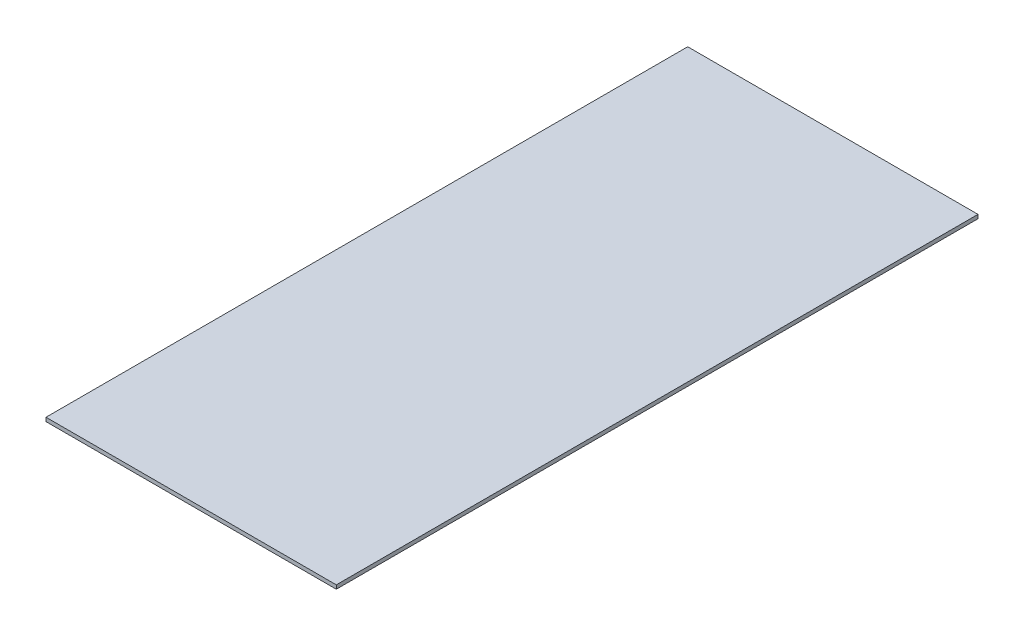
ISO-10303-21;
HEADER;
FILE_DESCRIPTION(('STEP AP214'),'2;1');
FILE_NAME('part.step','',(''),(''),'','','');
FILE_SCHEMA(('AUTOMOTIVE_DESIGN { 1 0 10303 214 1 1 1 1 }'));
ENDSEC;
DATA;
#1=APPLICATION_CONTEXT('core data for automotive mechanical design processes');
#2=APPLICATION_PROTOCOL_DEFINITION('international standard','automotive_design',2000,#1);
#3=PRODUCT_CONTEXT('',#1,'mechanical');
#4=PRODUCT('Part','Part','',(#3));
#5=PRODUCT_RELATED_PRODUCT_CATEGORY('part','',(#4));
#6=PRODUCT_DEFINITION_FORMATION('','',#4);
#7=PRODUCT_DEFINITION_CONTEXT('part definition',#1,'design');
#8=PRODUCT_DEFINITION('design','',#6,#7);
#9=PRODUCT_DEFINITION_SHAPE('','',#8);
#10=(LENGTH_UNIT() NAMED_UNIT(*) SI_UNIT(.MILLI.,.METRE.));
#11=(NAMED_UNIT(*) PLANE_ANGLE_UNIT() SI_UNIT($,.RADIAN.));
#12=(NAMED_UNIT(*) SI_UNIT($,.STERADIAN.) SOLID_ANGLE_UNIT());
#13=UNCERTAINTY_MEASURE_WITH_UNIT(LENGTH_MEASURE(1.E-05),#10,'distance_accuracy_value','');
#14=(GEOMETRIC_REPRESENTATION_CONTEXT(3) GLOBAL_UNCERTAINTY_ASSIGNED_CONTEXT((#13)) GLOBAL_UNIT_ASSIGNED_CONTEXT((#10,
#11,#12)) REPRESENTATION_CONTEXT('',''));
#15=CARTESIAN_POINT('',(0.,0.,0.));
#16=DIRECTION('',(0.,0.,1.));
#17=DIRECTION('',(1.,0.,0.));
#18=AXIS2_PLACEMENT_3D('',#15,#16,#17);
#19=CARTESIAN_POINT('',(-241.3,-3.17500000000003,1066.8));
#20=DIRECTION('',(1.,0.,0.));
#21=DIRECTION('',(0.,0.,-1.));
#22=AXIS2_PLACEMENT_3D('',#19,#20,#21);
#23=PLANE('',#22);
#24=DIRECTION('',(0.,-1.,0.));
#25=VECTOR('',#24,1.);
#26=CARTESIAN_POINT('',(-241.3,-3.17500000000003,0.));
#27=LINE('',#26,#25);
#28=CARTESIAN_POINT('',(-241.3,3.17499999999997,0.));
#29=VERTEX_POINT('',#28);
#30=CARTESIAN_POINT('',(-241.3,-3.17500000000003,0.));
#31=VERTEX_POINT('',#30);
#32=EDGE_CURVE('E107',#29,#31,#27,.T.);
#33=ORIENTED_EDGE('',*,*,#32,.T.);
#34=DIRECTION('',(0.,0.,-1.));
#35=VECTOR('',#34,1.);
#36=CARTESIAN_POINT('',(-241.3,-3.17500000000003,1066.8));
#37=LINE('',#36,#35);
#38=CARTESIAN_POINT('',(-241.3,-3.17500000000003,1066.8));
#39=VERTEX_POINT('',#38);
#40=EDGE_CURVE('E11',#39,#31,#37,.T.);
#41=ORIENTED_EDGE('',*,*,#40,.F.);
#42=DIRECTION('',(0.,-1.,0.));
#43=VECTOR('',#42,1.);
#44=CARTESIAN_POINT('',(-241.3,-3.17500000000003,1066.8));
#45=LINE('',#44,#43);
#46=CARTESIAN_POINT('',(-241.3,3.17499999999997,1066.8));
#47=VERTEX_POINT('',#46);
#48=EDGE_CURVE('E91',#47,#39,#45,.T.);
#49=ORIENTED_EDGE('',*,*,#48,.F.);
#50=DIRECTION('',(0.,0.,-1.));
#51=VECTOR('',#50,1.);
#52=CARTESIAN_POINT('',(-241.3,3.17499999999997,1066.8));
#53=LINE('',#52,#51);
#54=EDGE_CURVE('E103',#47,#29,#53,.T.);
#55=ORIENTED_EDGE('',*,*,#54,.T.);
#56=EDGE_LOOP('',(#33,#41,#49,#55));
#57=FACE_BOUND('',#56,.T.);
#58=ADVANCED_FACE('F39',(#57),#23,.F.);
#59=CARTESIAN_POINT('',(241.3,-3.17499999999997,1066.8));
#60=DIRECTION('',(0.,1.,0.));
#61=DIRECTION('',(-1.,0.,0.));
#62=AXIS2_PLACEMENT_3D('',#59,#60,#61);
#63=PLANE('',#62);
#64=DIRECTION('',(1.,0.,0.));
#65=VECTOR('',#64,1.);
#66=CARTESIAN_POINT('',(241.3,-3.17499999999997,0.));
#67=LINE('',#66,#65);
#68=CARTESIAN_POINT('',(241.3,-3.17499999999997,0.));
#69=VERTEX_POINT('',#68);
#70=EDGE_CURVE('E96',#31,#69,#67,.T.);
#71=ORIENTED_EDGE('',*,*,#70,.T.);
#72=DIRECTION('',(0.,0.,-1.));
#73=VECTOR('',#72,1.);
#74=CARTESIAN_POINT('',(241.3,-3.17499999999997,1066.8));
#75=LINE('',#74,#73);
#76=CARTESIAN_POINT('',(241.3,-3.17499999999997,1066.8));
#77=VERTEX_POINT('',#76);
#78=EDGE_CURVE('E48',#77,#69,#75,.T.);
#79=ORIENTED_EDGE('',*,*,#78,.F.);
#80=DIRECTION('',(1.,0.,0.));
#81=VECTOR('',#80,1.);
#82=CARTESIAN_POINT('',(241.3,-3.17499999999997,1066.8));
#83=LINE('',#82,#81);
#84=EDGE_CURVE('E86',#39,#77,#83,.T.);
#85=ORIENTED_EDGE('',*,*,#84,.F.);
#86=ORIENTED_EDGE('',*,*,#40,.T.);
#87=EDGE_LOOP('',(#71,#79,#85,#86));
#88=FACE_BOUND('',#87,.T.);
#89=ADVANCED_FACE('F95',(#88),#63,.F.);
#90=CARTESIAN_POINT('',(241.3,-3.17499999999997,1066.8));
#91=DIRECTION('',(-1.,0.,0.));
#92=DIRECTION('',(0.,0.,1.));
#93=AXIS2_PLACEMENT_3D('',#90,#91,#92);
#94=PLANE('',#93);
#95=DIRECTION('',(0.,1.,0.));
#96=VECTOR('',#95,1.);
#97=CARTESIAN_POINT('',(241.3,-3.17499999999997,0.));
#98=LINE('',#97,#96);
#99=CARTESIAN_POINT('',(241.3,3.17500000000003,0.));
#100=VERTEX_POINT('',#99);
#101=EDGE_CURVE('E73',#69,#100,#98,.T.);
#102=ORIENTED_EDGE('',*,*,#101,.T.);
#103=DIRECTION('',(0.,0.,-1.));
#104=VECTOR('',#103,1.);
#105=CARTESIAN_POINT('',(241.3,3.17500000000003,1066.8));
#106=LINE('',#105,#104);
#107=CARTESIAN_POINT('',(241.3,3.17500000000003,1066.8));
#108=VERTEX_POINT('',#107);
#109=EDGE_CURVE('E98',#108,#100,#106,.T.);
#110=ORIENTED_EDGE('',*,*,#109,.F.);
#111=DIRECTION('',(0.,1.,0.));
#112=VECTOR('',#111,1.);
#113=CARTESIAN_POINT('',(241.3,-3.17499999999997,1066.8));
#114=LINE('',#113,#112);
#115=EDGE_CURVE('E89',#77,#108,#114,.T.);
#116=ORIENTED_EDGE('',*,*,#115,.F.);
#117=ORIENTED_EDGE('',*,*,#78,.T.);
#118=EDGE_LOOP('',(#102,#110,#116,#117));
#119=FACE_BOUND('',#118,.T.);
#120=ADVANCED_FACE('F99',(#119),#94,.F.);
#121=CARTESIAN_POINT('',(241.3,3.17500000000003,1066.8));
#122=DIRECTION('',(0.,-1.,0.));
#123=DIRECTION('',(1.,0.,0.));
#124=AXIS2_PLACEMENT_3D('',#121,#122,#123);
#125=PLANE('',#124);
#126=DIRECTION('',(-1.,0.,0.));
#127=VECTOR('',#126,1.);
#128=CARTESIAN_POINT('',(241.3,3.17500000000003,0.));
#129=LINE('',#128,#127);
#130=EDGE_CURVE('E79',#100,#29,#129,.T.);
#131=ORIENTED_EDGE('',*,*,#130,.T.);
#132=ORIENTED_EDGE('',*,*,#54,.F.);
#133=DIRECTION('',(-1.,0.,0.));
#134=VECTOR('',#133,1.);
#135=CARTESIAN_POINT('',(241.3,3.17500000000003,1066.8));
#136=LINE('',#135,#134);
#137=EDGE_CURVE('E56',#108,#47,#136,.T.);
#138=ORIENTED_EDGE('',*,*,#137,.F.);
#139=ORIENTED_EDGE('',*,*,#109,.T.);
#140=EDGE_LOOP('',(#131,#132,#138,#139));
#141=FACE_BOUND('',#140,.T.);
#142=ADVANCED_FACE('F120',(#141),#125,.F.);
#143=CARTESIAN_POINT('',(0.,0.,1066.8));
#144=DIRECTION('',(0.,0.,1.));
#145=DIRECTION('',(1.,0.,0.));
#146=AXIS2_PLACEMENT_3D('',#143,#144,#145);
#147=PLANE('',#146);
#148=ORIENTED_EDGE('',*,*,#48,.T.);
#149=ORIENTED_EDGE('',*,*,#84,.T.);
#150=ORIENTED_EDGE('',*,*,#115,.T.);
#151=ORIENTED_EDGE('',*,*,#137,.T.);
#152=EDGE_LOOP('',(#148,#149,#150,#151));
#153=FACE_BOUND('',#152,.T.);
#154=ADVANCED_FACE('F87',(#153),#147,.T.);
#155=CARTESIAN_POINT('',(0.,0.,0.));
#156=DIRECTION('',(0.,0.,1.));
#157=DIRECTION('',(1.,0.,0.));
#158=AXIS2_PLACEMENT_3D('',#155,#156,#157);
#159=PLANE('',#158);
#160=ORIENTED_EDGE('',*,*,#32,.F.);
#161=ORIENTED_EDGE('',*,*,#130,.F.);
#162=ORIENTED_EDGE('',*,*,#101,.F.);
#163=ORIENTED_EDGE('',*,*,#70,.F.);
#164=EDGE_LOOP('',(#160,#161,#162,#163));
#165=FACE_BOUND('',#164,.T.);
#166=ADVANCED_FACE('F123',(#165),#159,.F.);
#167=CLOSED_SHELL('',(#58,#89,#120,#142,#154,#166));
#168=MANIFOLD_SOLID_BREP('B2',#167);
#169=ADVANCED_BREP_SHAPE_REPRESENTATION('',(#18,#168),#14);
#170=SHAPE_DEFINITION_REPRESENTATION(#9,#169);
ENDSEC;
END-ISO-10303-21;
